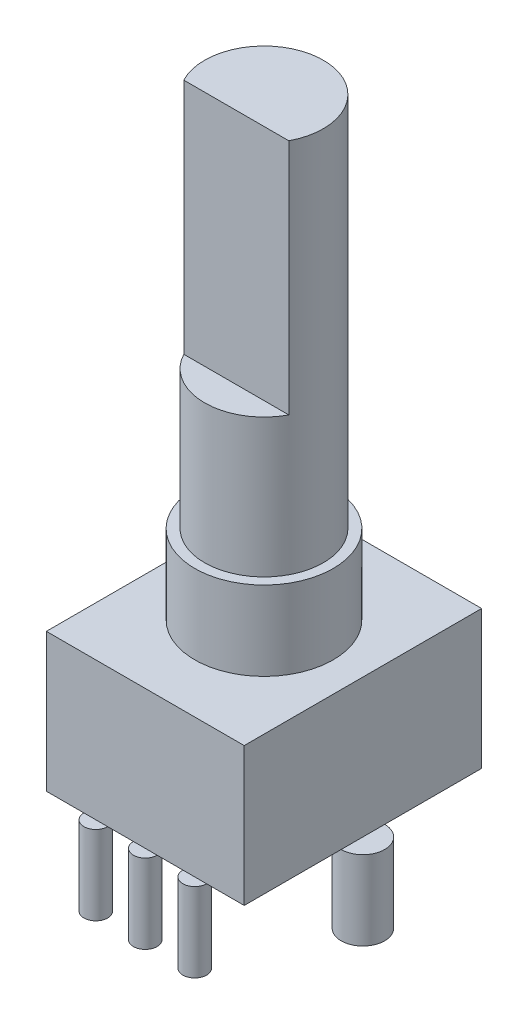
ISO-10303-21;
HEADER;
FILE_DESCRIPTION(('STEP AP214'),'2;1');
FILE_NAME('part.step','',(''),(''),'','','');
FILE_SCHEMA(('AUTOMOTIVE_DESIGN { 1 0 10303 214 1 1 1 1 }'));
ENDSEC;
DATA;
#1=APPLICATION_CONTEXT('core data for automotive mechanical design processes');
#2=APPLICATION_PROTOCOL_DEFINITION('international standard','automotive_design',2000,#1);
#3=PRODUCT_CONTEXT('',#1,'mechanical');
#4=PRODUCT('Part','Part','',(#3));
#5=PRODUCT_RELATED_PRODUCT_CATEGORY('part','',(#4));
#6=PRODUCT_DEFINITION_FORMATION('','',#4);
#7=PRODUCT_DEFINITION_CONTEXT('part definition',#1,'design');
#8=PRODUCT_DEFINITION('design','',#6,#7);
#9=PRODUCT_DEFINITION_SHAPE('','',#8);
#10=(LENGTH_UNIT() NAMED_UNIT(*) SI_UNIT(.MILLI.,.METRE.));
#11=(NAMED_UNIT(*) PLANE_ANGLE_UNIT() SI_UNIT($,.RADIAN.));
#12=(NAMED_UNIT(*) SI_UNIT($,.STERADIAN.) SOLID_ANGLE_UNIT());
#13=UNCERTAINTY_MEASURE_WITH_UNIT(LENGTH_MEASURE(1.E-05),#10,'distance_accuracy_value','');
#14=(GEOMETRIC_REPRESENTATION_CONTEXT(3) GLOBAL_UNCERTAINTY_ASSIGNED_CONTEXT((#13)) GLOBAL_UNIT_ASSIGNED_CONTEXT((#10,
#11,#12)) REPRESENTATION_CONTEXT('',''));
#15=CARTESIAN_POINT('',(0.,0.,0.));
#16=DIRECTION('',(0.,0.,1.));
#17=DIRECTION('',(1.,0.,0.));
#18=AXIS2_PLACEMENT_3D('',#15,#16,#17);
#19=CARTESIAN_POINT('',(0.,7.,0.));
#20=DIRECTION('',(0.,-1.,0.));
#21=DIRECTION('',(0.,0.,-1.));
#22=AXIS2_PLACEMENT_3D('',#19,#20,#21);
#23=CYLINDRICAL_SURFACE('',#22,3.);
#24=CARTESIAN_POINT('',(0.,7.,0.));
#25=DIRECTION('',(0.,1.,0.));
#26=DIRECTION('',(0.,0.,1.));
#27=AXIS2_PLACEMENT_3D('',#24,#25,#26);
#28=CIRCLE('',#27,3.);
#29=CARTESIAN_POINT('',(-2.65329983228432,7.,1.4));
#30=VERTEX_POINT('',#29);
#31=CARTESIAN_POINT('',(2.65329983228432,7.,1.4));
#32=VERTEX_POINT('',#31);
#33=EDGE_CURVE('E217',#30,#32,#28,.T.);
#34=ORIENTED_EDGE('',*,*,#33,.F.);
#35=DIRECTION('',(0.,-1.,0.));
#36=VECTOR('',#35,1.);
#37=CARTESIAN_POINT('',(-2.65329983228432,19.,1.4));
#38=LINE('',#37,#36);
#39=CARTESIAN_POINT('',(-2.65329983228432,19.,1.4));
#40=VERTEX_POINT('',#39);
#41=EDGE_CURVE('E214',#40,#30,#38,.T.);
#42=ORIENTED_EDGE('',*,*,#41,.F.);
#43=CARTESIAN_POINT('',(0.,19.,0.));
#44=DIRECTION('',(0.,1.,0.));
#45=DIRECTION('',(0.,0.,1.));
#46=AXIS2_PLACEMENT_3D('',#43,#44,#45);
#47=CIRCLE('',#46,3.);
#48=CARTESIAN_POINT('',(2.65329983228432,19.,1.4));
#49=VERTEX_POINT('',#48);
#50=EDGE_CURVE('E203',#49,#40,#47,.T.);
#51=ORIENTED_EDGE('',*,*,#50,.F.);
#52=DIRECTION('',(0.,-1.,0.));
#53=VECTOR('',#52,1.);
#54=CARTESIAN_POINT('',(2.65329983228432,19.,1.4));
#55=LINE('',#54,#53);
#56=EDGE_CURVE('E209',#49,#32,#55,.T.);
#57=ORIENTED_EDGE('',*,*,#56,.T.);
#58=EDGE_LOOP('',(#34,#42,#51,#57));
#59=FACE_BOUND('',#58,.T.);
#60=CARTESIAN_POINT('',(0.,0.,0.));
#61=DIRECTION('',(0.,1.,0.));
#62=DIRECTION('',(0.,0.,1.));
#63=AXIS2_PLACEMENT_3D('',#60,#61,#62);
#64=CIRCLE('',#63,3.);
#65=CARTESIAN_POINT('',(0.,0.,3.));
#66=VERTEX_POINT('',#65);
#67=EDGE_CURVE('E200',#66,#66,#64,.T.);
#68=ORIENTED_EDGE('',*,*,#67,.T.);
#69=EDGE_LOOP('',(#68));
#70=FACE_BOUND('',#69,.T.);
#71=ADVANCED_FACE('F34',(#59,#70),#23,.T.);
#72=CARTESIAN_POINT('',(0.,7.,0.));
#73=DIRECTION('',(0.,1.,0.));
#74=DIRECTION('',(0.,0.,1.));
#75=AXIS2_PLACEMENT_3D('',#72,#73,#74);
#76=PLANE('',#75);
#77=DIRECTION('',(1.,0.,0.));
#78=VECTOR('',#77,1.);
#79=CARTESIAN_POINT('',(-2.65329983228432,7.,1.4));
#80=LINE('',#79,#78);
#81=EDGE_CURVE('E207',#30,#32,#80,.T.);
#82=ORIENTED_EDGE('',*,*,#81,.F.);
#83=ORIENTED_EDGE('',*,*,#33,.T.);
#84=EDGE_LOOP('',(#82,#83));
#85=FACE_BOUND('',#84,.T.);
#86=ADVANCED_FACE('F252',(#85),#76,.T.);
#87=CARTESIAN_POINT('',(-2.65329983228432,19.,1.4));
#88=DIRECTION('',(0.,0.,-1.));
#89=DIRECTION('',(-1.,0.,0.));
#90=AXIS2_PLACEMENT_3D('',#87,#88,#89);
#91=PLANE('',#90);
#92=ORIENTED_EDGE('',*,*,#81,.T.);
#93=ORIENTED_EDGE('',*,*,#56,.F.);
#94=DIRECTION('',(1.,0.,0.));
#95=VECTOR('',#94,1.);
#96=CARTESIAN_POINT('',(-2.65329983228432,19.,1.4));
#97=LINE('',#96,#95);
#98=EDGE_CURVE('E206',#40,#49,#97,.T.);
#99=ORIENTED_EDGE('',*,*,#98,.F.);
#100=ORIENTED_EDGE('',*,*,#41,.T.);
#101=EDGE_LOOP('',(#92,#93,#99,#100));
#102=FACE_BOUND('',#101,.T.);
#103=ADVANCED_FACE('F257',(#102),#91,.F.);
#104=CARTESIAN_POINT('',(0.,19.,0.));
#105=DIRECTION('',(0.,1.,0.));
#106=DIRECTION('',(0.,0.,1.));
#107=AXIS2_PLACEMENT_3D('',#104,#105,#106);
#108=PLANE('',#107);
#109=ORIENTED_EDGE('',*,*,#50,.T.);
#110=ORIENTED_EDGE('',*,*,#98,.T.);
#111=EDGE_LOOP('',(#109,#110));
#112=FACE_BOUND('',#111,.T.);
#113=ADVANCED_FACE('F273',(#112),#108,.T.);
#114=CARTESIAN_POINT('',(0.,-4.,0.));
#115=DIRECTION('',(0.,1.,0.));
#116=DIRECTION('',(0.,0.,1.));
#117=AXIS2_PLACEMENT_3D('',#114,#115,#116);
#118=CYLINDRICAL_SURFACE('',#117,3.5);
#119=CARTESIAN_POINT('',(0.,-4.,0.));
#120=DIRECTION('',(0.,-1.,0.));
#121=DIRECTION('',(0.,0.,-1.));
#122=AXIS2_PLACEMENT_3D('',#119,#120,#121);
#123=CIRCLE('',#122,3.5);
#124=CARTESIAN_POINT('',(0.,-4.,-3.5));
#125=VERTEX_POINT('',#124);
#126=EDGE_CURVE('E197',#125,#125,#123,.T.);
#127=ORIENTED_EDGE('',*,*,#126,.F.);
#128=EDGE_LOOP('',(#127));
#129=FACE_BOUND('',#128,.T.);
#130=CARTESIAN_POINT('',(0.,0.,0.));
#131=DIRECTION('',(0.,-1.,0.));
#132=DIRECTION('',(0.,0.,-1.));
#133=AXIS2_PLACEMENT_3D('',#130,#131,#132);
#134=CIRCLE('',#133,3.5);
#135=CARTESIAN_POINT('',(0.,0.,-3.5));
#136=VERTEX_POINT('',#135);
#137=EDGE_CURVE('E196',#136,#136,#134,.T.);
#138=ORIENTED_EDGE('',*,*,#137,.T.);
#139=EDGE_LOOP('',(#138));
#140=FACE_BOUND('',#139,.T.);
#141=ADVANCED_FACE('F268',(#129,#140),#118,.T.);
#142=CARTESIAN_POINT('',(0.,0.,0.));
#143=DIRECTION('',(0.,-1.,0.));
#144=DIRECTION('',(0.,0.,-1.));
#145=AXIS2_PLACEMENT_3D('',#142,#143,#144);
#146=PLANE('',#145);
#147=ORIENTED_EDGE('',*,*,#67,.F.);
#148=EDGE_LOOP('',(#147));
#149=FACE_BOUND('',#148,.T.);
#150=ORIENTED_EDGE('',*,*,#137,.F.);
#151=EDGE_LOOP('',(#150));
#152=FACE_BOUND('',#151,.T.);
#153=ADVANCED_FACE('F264',(#149,#152),#146,.F.);
#154=CARTESIAN_POINT('',(-5.,-11.,-6.));
#155=DIRECTION('',(1.,0.,0.));
#156=DIRECTION('',(0.,0.,-1.));
#157=AXIS2_PLACEMENT_3D('',#154,#155,#156);
#158=PLANE('',#157);
#159=DIRECTION('',(0.,0.,-1.));
#160=VECTOR('',#159,1.);
#161=CARTESIAN_POINT('',(-5.,-4.,-6.));
#162=LINE('',#161,#160);
#163=CARTESIAN_POINT('',(-5.,-4.,6.));
#164=VERTEX_POINT('',#163);
#165=CARTESIAN_POINT('',(-5.,-4.,-6.));
#166=VERTEX_POINT('',#165);
#167=EDGE_CURVE('E161',#164,#166,#162,.T.);
#168=ORIENTED_EDGE('',*,*,#167,.T.);
#169=DIRECTION('',(0.,1.,0.));
#170=VECTOR('',#169,1.);
#171=CARTESIAN_POINT('',(-5.,-11.,-6.));
#172=LINE('',#171,#170);
#173=CARTESIAN_POINT('',(-5.,-11.,-6.));
#174=VERTEX_POINT('',#173);
#175=EDGE_CURVE('E193',#174,#166,#172,.T.);
#176=ORIENTED_EDGE('',*,*,#175,.F.);
#177=DIRECTION('',(0.,0.,-1.));
#178=VECTOR('',#177,1.);
#179=CARTESIAN_POINT('',(-5.,-11.,-6.));
#180=LINE('',#179,#178);
#181=CARTESIAN_POINT('',(-5.,-11.,-1.09999929514087));
#182=VERTEX_POINT('',#181);
#183=EDGE_CURVE('E169',#182,#174,#180,.T.);
#184=ORIENTED_EDGE('',*,*,#183,.F.);
#185=CARTESIAN_POINT('',(-5.,-11.,1.09999929514087));
#186=VERTEX_POINT('',#185);
#187=EDGE_CURVE('E168',#186,#182,#180,.T.);
#188=ORIENTED_EDGE('',*,*,#187,.F.);
#189=CARTESIAN_POINT('',(-5.,-11.,6.));
#190=VERTEX_POINT('',#189);
#191=EDGE_CURVE('E165',#190,#186,#180,.T.);
#192=ORIENTED_EDGE('',*,*,#191,.F.);
#193=DIRECTION('',(0.,1.,0.));
#194=VECTOR('',#193,1.);
#195=CARTESIAN_POINT('',(-5.,-11.,6.));
#196=LINE('',#195,#194);
#197=EDGE_CURVE('E176',#190,#164,#196,.T.);
#198=ORIENTED_EDGE('',*,*,#197,.T.);
#199=EDGE_LOOP('',(#168,#176,#184,#188,#192,#198));
#200=FACE_BOUND('',#199,.T.);
#201=ADVANCED_FACE('F267',(#200),#158,.F.);
#202=CARTESIAN_POINT('',(-5.,-11.,-6.));
#203=DIRECTION('',(0.,0.,1.));
#204=DIRECTION('',(1.,0.,0.));
#205=AXIS2_PLACEMENT_3D('',#202,#203,#204);
#206=PLANE('',#205);
#207=DIRECTION('',(1.,0.,0.));
#208=VECTOR('',#207,1.);
#209=CARTESIAN_POINT('',(-5.,-4.,-6.));
#210=LINE('',#209,#208);
#211=CARTESIAN_POINT('',(5.,-4.,-6.));
#212=VERTEX_POINT('',#211);
#213=EDGE_CURVE('E179',#166,#212,#210,.T.);
#214=ORIENTED_EDGE('',*,*,#213,.T.);
#215=DIRECTION('',(0.,1.,0.));
#216=VECTOR('',#215,1.);
#217=CARTESIAN_POINT('',(5.,-11.,-6.));
#218=LINE('',#217,#216);
#219=CARTESIAN_POINT('',(5.,-11.,-6.));
#220=VERTEX_POINT('',#219);
#221=EDGE_CURVE('E190',#220,#212,#218,.T.);
#222=ORIENTED_EDGE('',*,*,#221,.F.);
#223=DIRECTION('',(1.,0.,0.));
#224=VECTOR('',#223,1.);
#225=CARTESIAN_POINT('',(-5.,-11.,-6.));
#226=LINE('',#225,#224);
#227=EDGE_CURVE('E167',#174,#220,#226,.T.);
#228=ORIENTED_EDGE('',*,*,#227,.F.);
#229=ORIENTED_EDGE('',*,*,#175,.T.);
#230=EDGE_LOOP('',(#214,#222,#228,#229));
#231=FACE_BOUND('',#230,.T.);
#232=ADVANCED_FACE('F313',(#231),#206,.F.);
#233=CARTESIAN_POINT('',(5.,-11.,-6.));
#234=DIRECTION('',(-1.,0.,0.));
#235=DIRECTION('',(0.,0.,1.));
#236=AXIS2_PLACEMENT_3D('',#233,#234,#235);
#237=PLANE('',#236);
#238=DIRECTION('',(0.,0.,1.));
#239=VECTOR('',#238,1.);
#240=CARTESIAN_POINT('',(5.,-4.,-6.));
#241=LINE('',#240,#239);
#242=CARTESIAN_POINT('',(5.,-4.,6.));
#243=VERTEX_POINT('',#242);
#244=EDGE_CURVE('E181',#212,#243,#241,.T.);
#245=ORIENTED_EDGE('',*,*,#244,.T.);
#246=DIRECTION('',(0.,1.,0.));
#247=VECTOR('',#246,1.);
#248=CARTESIAN_POINT('',(5.,-11.,6.));
#249=LINE('',#248,#247);
#250=CARTESIAN_POINT('',(5.,-11.,6.));
#251=VERTEX_POINT('',#250);
#252=EDGE_CURVE('E187',#251,#243,#249,.T.);
#253=ORIENTED_EDGE('',*,*,#252,.F.);
#254=DIRECTION('',(0.,0.,1.));
#255=VECTOR('',#254,1.);
#256=CARTESIAN_POINT('',(5.,-11.,-6.));
#257=LINE('',#256,#255);
#258=CARTESIAN_POINT('',(5.,-11.,1.1));
#259=VERTEX_POINT('',#258);
#260=EDGE_CURVE('E171',#259,#251,#257,.T.);
#261=ORIENTED_EDGE('',*,*,#260,.F.);
#262=CARTESIAN_POINT('',(5.,-11.,-1.1));
#263=VERTEX_POINT('',#262);
#264=EDGE_CURVE('E173',#263,#259,#257,.T.);
#265=ORIENTED_EDGE('',*,*,#264,.F.);
#266=EDGE_CURVE('E172',#220,#263,#257,.T.);
#267=ORIENTED_EDGE('',*,*,#266,.F.);
#268=ORIENTED_EDGE('',*,*,#221,.T.);
#269=EDGE_LOOP('',(#245,#253,#261,#265,#267,#268));
#270=FACE_BOUND('',#269,.T.);
#271=ADVANCED_FACE('F319',(#270),#237,.F.);
#272=CARTESIAN_POINT('',(-5.,-11.,6.));
#273=DIRECTION('',(0.,0.,-1.));
#274=DIRECTION('',(-1.,0.,0.));
#275=AXIS2_PLACEMENT_3D('',#272,#273,#274);
#276=PLANE('',#275);
#277=DIRECTION('',(-1.,0.,0.));
#278=VECTOR('',#277,1.);
#279=CARTESIAN_POINT('',(-5.,-4.,6.));
#280=LINE('',#279,#278);
#281=EDGE_CURVE('E183',#243,#164,#280,.T.);
#282=ORIENTED_EDGE('',*,*,#281,.T.);
#283=ORIENTED_EDGE('',*,*,#197,.F.);
#284=DIRECTION('',(-1.,0.,0.));
#285=VECTOR('',#284,1.);
#286=CARTESIAN_POINT('',(-5.,-11.,6.));
#287=LINE('',#286,#285);
#288=CARTESIAN_POINT('',(-3.1,-11.,6.));
#289=VERTEX_POINT('',#288);
#290=EDGE_CURVE('E125',#289,#190,#287,.T.);
#291=ORIENTED_EDGE('',*,*,#290,.F.);
#292=CARTESIAN_POINT('',(-1.9,-11.,6.));
#293=VERTEX_POINT('',#292);
#294=EDGE_CURVE('E119',#293,#289,#287,.T.);
#295=ORIENTED_EDGE('',*,*,#294,.F.);
#296=CARTESIAN_POINT('',(-0.599999999999999,-11.,6.));
#297=VERTEX_POINT('',#296);
#298=EDGE_CURVE('E110',#297,#293,#287,.T.);
#299=ORIENTED_EDGE('',*,*,#298,.F.);
#300=CARTESIAN_POINT('',(0.600000000000001,-11.,6.));
#301=VERTEX_POINT('',#300);
#302=EDGE_CURVE('E118',#301,#297,#287,.T.);
#303=ORIENTED_EDGE('',*,*,#302,.F.);
#304=CARTESIAN_POINT('',(1.9,-11.,6.));
#305=VERTEX_POINT('',#304);
#306=EDGE_CURVE('E129',#305,#301,#287,.T.);
#307=ORIENTED_EDGE('',*,*,#306,.F.);
#308=CARTESIAN_POINT('',(3.1,-11.,6.));
#309=VERTEX_POINT('',#308);
#310=EDGE_CURVE('E121',#309,#305,#287,.T.);
#311=ORIENTED_EDGE('',*,*,#310,.F.);
#312=EDGE_CURVE('E174',#251,#309,#287,.T.);
#313=ORIENTED_EDGE('',*,*,#312,.F.);
#314=ORIENTED_EDGE('',*,*,#252,.T.);
#315=EDGE_LOOP('',(#282,#283,#291,#295,#299,#303,#307,#311,#313,#314));
#316=FACE_BOUND('',#315,.T.);
#317=ADVANCED_FACE('F123',(#316),#276,.F.);
#318=CARTESIAN_POINT('',(0.,-11.,0.));
#319=DIRECTION('',(0.,1.,0.));
#320=DIRECTION('',(0.,0.,1.));
#321=AXIS2_PLACEMENT_3D('',#318,#319,#320);
#322=PLANE('',#321);
#323=CARTESIAN_POINT('',(-2.5,-11.,6.));
#324=DIRECTION('',(0.,1.,0.));
#325=DIRECTION('',(0.,0.,1.));
#326=AXIS2_PLACEMENT_3D('',#323,#324,#325);
#327=CIRCLE('',#326,0.6);
#328=EDGE_CURVE('E11',#289,#293,#327,.F.);
#329=ORIENTED_EDGE('',*,*,#328,.F.);
#330=ORIENTED_EDGE('',*,*,#290,.T.);
#331=ORIENTED_EDGE('',*,*,#191,.T.);
#332=CARTESIAN_POINT('',(-5.00124526687685,-11.,0.));
#333=DIRECTION('',(0.,-1.,0.));
#334=DIRECTION('',(0.,0.,-1.));
#335=AXIS2_PLACEMENT_3D('',#332,#333,#334);
#336=CIRCLE('',#335,1.1);
#337=EDGE_CURVE('E162',#182,#186,#336,.T.);
#338=ORIENTED_EDGE('',*,*,#337,.F.);
#339=ORIENTED_EDGE('',*,*,#183,.T.);
#340=ORIENTED_EDGE('',*,*,#227,.T.);
#341=ORIENTED_EDGE('',*,*,#266,.T.);
#342=CARTESIAN_POINT('',(5.,-11.,0.));
#343=DIRECTION('',(0.,1.,0.));
#344=DIRECTION('',(0.,0.,1.));
#345=AXIS2_PLACEMENT_3D('',#342,#343,#344);
#346=CIRCLE('',#345,1.1);
#347=EDGE_CURVE('E219',#259,#263,#346,.F.);
#348=ORIENTED_EDGE('',*,*,#347,.F.);
#349=ORIENTED_EDGE('',*,*,#260,.T.);
#350=ORIENTED_EDGE('',*,*,#312,.T.);
#351=CARTESIAN_POINT('',(2.5,-11.,6.));
#352=DIRECTION('',(0.,1.,0.));
#353=DIRECTION('',(0.,0.,1.));
#354=AXIS2_PLACEMENT_3D('',#351,#352,#353);
#355=CIRCLE('',#354,0.6);
#356=EDGE_CURVE('E41',#305,#309,#355,.F.);
#357=ORIENTED_EDGE('',*,*,#356,.F.);
#358=ORIENTED_EDGE('',*,*,#306,.T.);
#359=CARTESIAN_POINT('',(0.,-11.,6.));
#360=DIRECTION('',(0.,1.,0.));
#361=DIRECTION('',(0.,0.,1.));
#362=AXIS2_PLACEMENT_3D('',#359,#360,#361);
#363=CIRCLE('',#362,0.6);
#364=EDGE_CURVE('E114',#297,#301,#363,.F.);
#365=ORIENTED_EDGE('',*,*,#364,.F.);
#366=ORIENTED_EDGE('',*,*,#298,.T.);
#367=EDGE_LOOP('',(#329,#330,#331,#338,#339,#340,#341,#348,#349,#350,#357,#358,#365,#366));
#368=FACE_BOUND('',#367,.T.);
#369=ADVANCED_FACE('F112',(#368),#322,.F.);
#370=CARTESIAN_POINT('',(0.,-4.,0.));
#371=DIRECTION('',(0.,1.,0.));
#372=DIRECTION('',(0.,0.,1.));
#373=AXIS2_PLACEMENT_3D('',#370,#371,#372);
#374=PLANE('',#373);
#375=ORIENTED_EDGE('',*,*,#126,.T.);
#376=EDGE_LOOP('',(#375));
#377=FACE_BOUND('',#376,.T.);
#378=ORIENTED_EDGE('',*,*,#167,.F.);
#379=ORIENTED_EDGE('',*,*,#281,.F.);
#380=ORIENTED_EDGE('',*,*,#244,.F.);
#381=ORIENTED_EDGE('',*,*,#213,.F.);
#382=EDGE_LOOP('',(#378,#379,#380,#381));
#383=FACE_BOUND('',#382,.T.);
#384=ADVANCED_FACE('F327',(#377,#383),#374,.T.);
#385=CARTESIAN_POINT('',(-5.00124526687685,-11.,0.));
#386=DIRECTION('',(0.,-1.,0.));
#387=DIRECTION('',(0.,0.,-1.));
#388=AXIS2_PLACEMENT_3D('',#385,#386,#387);
#389=PLANE('',#388);
#390=EDGE_CURVE('E155',#186,#182,#336,.T.);
#391=ORIENTED_EDGE('',*,*,#390,.F.);
#392=ORIENTED_EDGE('',*,*,#187,.T.);
#393=EDGE_LOOP('',(#391,#392));
#394=FACE_BOUND('',#393,.T.);
#395=ADVANCED_FACE('F332',(#394),#389,.F.);
#396=CARTESIAN_POINT('',(-5.00124526687685,-15.,0.));
#397=DIRECTION('',(0.,1.,0.));
#398=DIRECTION('',(0.,0.,1.));
#399=AXIS2_PLACEMENT_3D('',#396,#397,#398);
#400=CYLINDRICAL_SURFACE('',#399,1.1);
#401=CARTESIAN_POINT('',(-5.00124526687685,-15.,0.));
#402=DIRECTION('',(0.,-1.,0.));
#403=DIRECTION('',(0.,0.,-1.));
#404=AXIS2_PLACEMENT_3D('',#401,#402,#403);
#405=CIRCLE('',#404,1.1);
#406=CARTESIAN_POINT('',(-5.00124526687685,-15.,-1.1));
#407=VERTEX_POINT('',#406);
#408=EDGE_CURVE('E158',#407,#407,#405,.T.);
#409=ORIENTED_EDGE('',*,*,#408,.F.);
#410=EDGE_LOOP('',(#409));
#411=FACE_BOUND('',#410,.T.);
#412=ORIENTED_EDGE('',*,*,#337,.T.);
#413=ORIENTED_EDGE('',*,*,#390,.T.);
#414=EDGE_LOOP('',(#412,#413));
#415=FACE_BOUND('',#414,.T.);
#416=ADVANCED_FACE('F360',(#411,#415),#400,.T.);
#417=CARTESIAN_POINT('',(-5.00124526687685,-15.,0.));
#418=DIRECTION('',(0.,-1.,0.));
#419=DIRECTION('',(0.,0.,-1.));
#420=AXIS2_PLACEMENT_3D('',#417,#418,#419);
#421=PLANE('',#420);
#422=ORIENTED_EDGE('',*,*,#408,.T.);
#423=EDGE_LOOP('',(#422));
#424=FACE_BOUND('',#423,.T.);
#425=ADVANCED_FACE('F370',(#424),#421,.T.);
#426=CARTESIAN_POINT('',(5.,-11.,0.));
#427=DIRECTION('',(0.,-1.,0.));
#428=DIRECTION('',(0.,0.,-1.));
#429=AXIS2_PLACEMENT_3D('',#426,#427,#428);
#430=PLANE('',#429);
#431=CARTESIAN_POINT('',(5.,-11.,0.));
#432=DIRECTION('',(0.,-1.,0.));
#433=DIRECTION('',(0.,0.,-1.));
#434=AXIS2_PLACEMENT_3D('',#431,#432,#433);
#435=CIRCLE('',#434,1.1);
#436=EDGE_CURVE('E149',#263,#259,#435,.T.);
#437=ORIENTED_EDGE('',*,*,#436,.F.);
#438=ORIENTED_EDGE('',*,*,#264,.T.);
#439=EDGE_LOOP('',(#437,#438));
#440=FACE_BOUND('',#439,.T.);
#441=ADVANCED_FACE('F380',(#440),#430,.F.);
#442=CARTESIAN_POINT('',(5.,-15.,0.));
#443=DIRECTION('',(0.,1.,0.));
#444=DIRECTION('',(0.,0.,1.));
#445=AXIS2_PLACEMENT_3D('',#442,#443,#444);
#446=CYLINDRICAL_SURFACE('',#445,1.1);
#447=CARTESIAN_POINT('',(5.,-15.,0.));
#448=DIRECTION('',(0.,-1.,0.));
#449=DIRECTION('',(0.,0.,-1.));
#450=AXIS2_PLACEMENT_3D('',#447,#448,#449);
#451=CIRCLE('',#450,1.1);
#452=CARTESIAN_POINT('',(5.,-15.,-1.1));
#453=VERTEX_POINT('',#452);
#454=EDGE_CURVE('E152',#453,#453,#451,.T.);
#455=ORIENTED_EDGE('',*,*,#454,.F.);
#456=EDGE_LOOP('',(#455));
#457=FACE_BOUND('',#456,.T.);
#458=ORIENTED_EDGE('',*,*,#436,.T.);
#459=ORIENTED_EDGE('',*,*,#347,.T.);
#460=EDGE_LOOP('',(#458,#459));
#461=FACE_BOUND('',#460,.T.);
#462=ADVANCED_FACE('F390',(#457,#461),#446,.T.);
#463=CARTESIAN_POINT('',(5.,-15.,0.));
#464=DIRECTION('',(0.,-1.,0.));
#465=DIRECTION('',(0.,0.,-1.));
#466=AXIS2_PLACEMENT_3D('',#463,#464,#465);
#467=PLANE('',#466);
#468=ORIENTED_EDGE('',*,*,#454,.T.);
#469=EDGE_LOOP('',(#468));
#470=FACE_BOUND('',#469,.T.);
#471=ADVANCED_FACE('F247',(#470),#467,.T.);
#472=CARTESIAN_POINT('',(0.,-11.,6.));
#473=DIRECTION('',(0.,-1.,0.));
#474=DIRECTION('',(0.,0.,-1.));
#475=AXIS2_PLACEMENT_3D('',#472,#473,#474);
#476=PLANE('',#475);
#477=CARTESIAN_POINT('',(0.,-11.,6.));
#478=DIRECTION('',(0.,-1.,0.));
#479=DIRECTION('',(0.,0.,-1.));
#480=AXIS2_PLACEMENT_3D('',#477,#478,#479);
#481=CIRCLE('',#480,0.6);
#482=EDGE_CURVE('E143',#301,#297,#481,.T.);
#483=ORIENTED_EDGE('',*,*,#482,.F.);
#484=ORIENTED_EDGE('',*,*,#302,.T.);
#485=EDGE_LOOP('',(#483,#484));
#486=FACE_BOUND('',#485,.T.);
#487=ADVANCED_FACE('F234',(#486),#476,.F.);
#488=CARTESIAN_POINT('',(0.,-15.,6.));
#489=DIRECTION('',(0.,1.,0.));
#490=DIRECTION('',(0.,0.,1.));
#491=AXIS2_PLACEMENT_3D('',#488,#489,#490);
#492=CYLINDRICAL_SURFACE('',#491,0.6);
#493=CARTESIAN_POINT('',(0.,-15.,6.));
#494=DIRECTION('',(0.,-1.,0.));
#495=DIRECTION('',(0.,0.,-1.));
#496=AXIS2_PLACEMENT_3D('',#493,#494,#495);
#497=CIRCLE('',#496,0.6);
#498=CARTESIAN_POINT('',(0.,-15.,5.4));
#499=VERTEX_POINT('',#498);
#500=EDGE_CURVE('E146',#499,#499,#497,.T.);
#501=ORIENTED_EDGE('',*,*,#500,.F.);
#502=EDGE_LOOP('',(#501));
#503=FACE_BOUND('',#502,.T.);
#504=ORIENTED_EDGE('',*,*,#482,.T.);
#505=ORIENTED_EDGE('',*,*,#364,.T.);
#506=EDGE_LOOP('',(#504,#505));
#507=FACE_BOUND('',#506,.T.);
#508=ADVANCED_FACE('F236',(#503,#507),#492,.T.);
#509=CARTESIAN_POINT('',(0.,-15.,6.));
#510=DIRECTION('',(0.,-1.,0.));
#511=DIRECTION('',(0.,0.,-1.));
#512=AXIS2_PLACEMENT_3D('',#509,#510,#511);
#513=PLANE('',#512);
#514=ORIENTED_EDGE('',*,*,#500,.T.);
#515=EDGE_LOOP('',(#514));
#516=FACE_BOUND('',#515,.T.);
#517=ADVANCED_FACE('F238',(#516),#513,.T.);
#518=CARTESIAN_POINT('',(2.5,-11.,6.));
#519=DIRECTION('',(0.,-1.,0.));
#520=DIRECTION('',(0.,0.,-1.));
#521=AXIS2_PLACEMENT_3D('',#518,#519,#520);
#522=PLANE('',#521);
#523=CARTESIAN_POINT('',(2.5,-11.,6.));
#524=DIRECTION('',(0.,-1.,0.));
#525=DIRECTION('',(0.,0.,-1.));
#526=AXIS2_PLACEMENT_3D('',#523,#524,#525);
#527=CIRCLE('',#526,0.6);
#528=EDGE_CURVE('E137',#309,#305,#527,.T.);
#529=ORIENTED_EDGE('',*,*,#528,.F.);
#530=ORIENTED_EDGE('',*,*,#310,.T.);
#531=EDGE_LOOP('',(#529,#530));
#532=FACE_BOUND('',#531,.T.);
#533=ADVANCED_FACE('F229',(#532),#522,.F.);
#534=CARTESIAN_POINT('',(2.5,-15.,6.));
#535=DIRECTION('',(0.,1.,0.));
#536=DIRECTION('',(0.,0.,1.));
#537=AXIS2_PLACEMENT_3D('',#534,#535,#536);
#538=CYLINDRICAL_SURFACE('',#537,0.6);
#539=CARTESIAN_POINT('',(2.5,-15.,6.));
#540=DIRECTION('',(0.,-1.,0.));
#541=DIRECTION('',(0.,0.,-1.));
#542=AXIS2_PLACEMENT_3D('',#539,#540,#541);
#543=CIRCLE('',#542,0.6);
#544=CARTESIAN_POINT('',(2.5,-15.,5.4));
#545=VERTEX_POINT('',#544);
#546=EDGE_CURVE('E140',#545,#545,#543,.T.);
#547=ORIENTED_EDGE('',*,*,#546,.F.);
#548=EDGE_LOOP('',(#547));
#549=FACE_BOUND('',#548,.T.);
#550=ORIENTED_EDGE('',*,*,#528,.T.);
#551=ORIENTED_EDGE('',*,*,#356,.T.);
#552=EDGE_LOOP('',(#550,#551));
#553=FACE_BOUND('',#552,.T.);
#554=ADVANCED_FACE('F226',(#549,#553),#538,.T.);
#555=CARTESIAN_POINT('',(2.5,-15.,6.));
#556=DIRECTION('',(0.,-1.,0.));
#557=DIRECTION('',(0.,0.,-1.));
#558=AXIS2_PLACEMENT_3D('',#555,#556,#557);
#559=PLANE('',#558);
#560=ORIENTED_EDGE('',*,*,#546,.T.);
#561=EDGE_LOOP('',(#560));
#562=FACE_BOUND('',#561,.T.);
#563=ADVANCED_FACE('F454',(#562),#559,.T.);
#564=CARTESIAN_POINT('',(-2.5,-11.,6.));
#565=DIRECTION('',(0.,-1.,0.));
#566=DIRECTION('',(0.,0.,-1.));
#567=AXIS2_PLACEMENT_3D('',#564,#565,#566);
#568=PLANE('',#567);
#569=CARTESIAN_POINT('',(-2.5,-11.,6.));
#570=DIRECTION('',(0.,-1.,0.));
#571=DIRECTION('',(0.,0.,-1.));
#572=AXIS2_PLACEMENT_3D('',#569,#570,#571);
#573=CIRCLE('',#572,0.6);
#574=EDGE_CURVE('E132',#293,#289,#573,.T.);
#575=ORIENTED_EDGE('',*,*,#574,.F.);
#576=ORIENTED_EDGE('',*,*,#294,.T.);
#577=EDGE_LOOP('',(#575,#576));
#578=FACE_BOUND('',#577,.T.);
#579=ADVANCED_FACE('F133',(#578),#568,.F.);
#580=CARTESIAN_POINT('',(-2.5,-15.,6.));
#581=DIRECTION('',(0.,1.,0.));
#582=DIRECTION('',(0.,0.,1.));
#583=AXIS2_PLACEMENT_3D('',#580,#581,#582);
#584=CYLINDRICAL_SURFACE('',#583,0.6);
#585=CARTESIAN_POINT('',(-2.5,-15.,6.));
#586=DIRECTION('',(0.,-1.,0.));
#587=DIRECTION('',(0.,0.,-1.));
#588=AXIS2_PLACEMENT_3D('',#585,#586,#587);
#589=CIRCLE('',#588,0.6);
#590=CARTESIAN_POINT('',(-2.5,-15.,5.4));
#591=VERTEX_POINT('',#590);
#592=EDGE_CURVE('E134',#591,#591,#589,.T.);
#593=ORIENTED_EDGE('',*,*,#592,.F.);
#594=EDGE_LOOP('',(#593));
#595=FACE_BOUND('',#594,.T.);
#596=ORIENTED_EDGE('',*,*,#574,.T.);
#597=ORIENTED_EDGE('',*,*,#328,.T.);
#598=EDGE_LOOP('',(#596,#597));
#599=FACE_BOUND('',#598,.T.);
#600=ADVANCED_FACE('F131',(#595,#599),#584,.T.);
#601=CARTESIAN_POINT('',(-2.5,-15.,6.));
#602=DIRECTION('',(0.,-1.,0.));
#603=DIRECTION('',(0.,0.,-1.));
#604=AXIS2_PLACEMENT_3D('',#601,#602,#603);
#605=PLANE('',#604);
#606=ORIENTED_EDGE('',*,*,#592,.T.);
#607=EDGE_LOOP('',(#606));
#608=FACE_BOUND('',#607,.T.);
#609=ADVANCED_FACE('F481',(#608),#605,.T.);
#610=CLOSED_SHELL('',(#71,#86,#103,#113,#141,#153,#201,#232,#271,#317,#369,#384,#395,#416,#425,
#441,#462,#471,#487,#508,#517,#533,#554,#563,#579,#600,#609));
#611=MANIFOLD_SOLID_BREP('B2',#610);
#612=ADVANCED_BREP_SHAPE_REPRESENTATION('',(#18,#611),#14);
#613=SHAPE_DEFINITION_REPRESENTATION(#9,#612);
ENDSEC;
END-ISO-10303-21;
